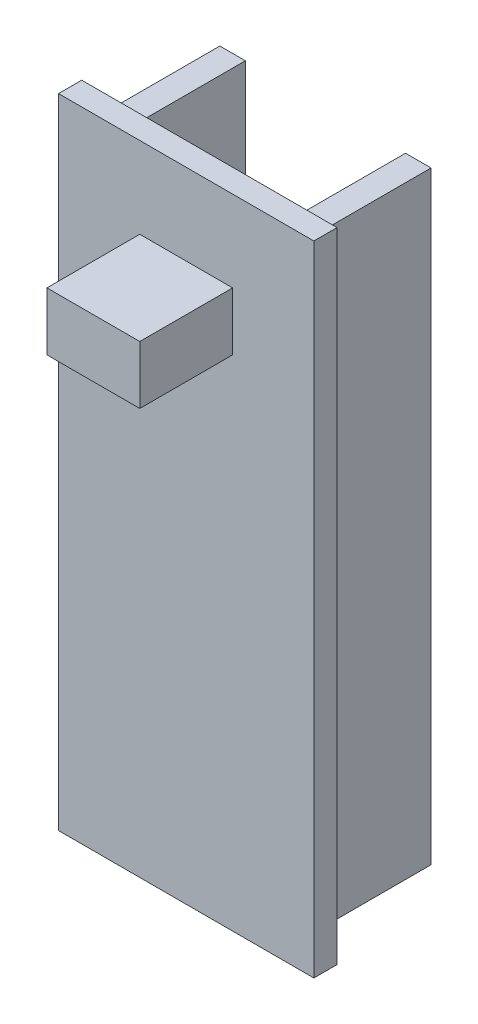
ISO-10303-21;
HEADER;
FILE_DESCRIPTION(('STEP AP214'),'2;1');
FILE_NAME('part.step','',(''),(''),'','','');
FILE_SCHEMA(('AUTOMOTIVE_DESIGN { 1 0 10303 214 1 1 1 1 }'));
ENDSEC;
DATA;
#1=APPLICATION_CONTEXT('core data for automotive mechanical design processes');
#2=APPLICATION_PROTOCOL_DEFINITION('international standard','automotive_design',2000,#1);
#3=PRODUCT_CONTEXT('',#1,'mechanical');
#4=PRODUCT('Part','Part','',(#3));
#5=PRODUCT_RELATED_PRODUCT_CATEGORY('part','',(#4));
#6=PRODUCT_DEFINITION_FORMATION('','',#4);
#7=PRODUCT_DEFINITION_CONTEXT('part definition',#1,'design');
#8=PRODUCT_DEFINITION('design','',#6,#7);
#9=PRODUCT_DEFINITION_SHAPE('','',#8);
#10=(LENGTH_UNIT() NAMED_UNIT(*) SI_UNIT(.MILLI.,.METRE.));
#11=(NAMED_UNIT(*) PLANE_ANGLE_UNIT() SI_UNIT($,.RADIAN.));
#12=(NAMED_UNIT(*) SI_UNIT($,.STERADIAN.) SOLID_ANGLE_UNIT());
#13=UNCERTAINTY_MEASURE_WITH_UNIT(LENGTH_MEASURE(1.E-05),#10,'distance_accuracy_value','');
#14=(GEOMETRIC_REPRESENTATION_CONTEXT(3) GLOBAL_UNCERTAINTY_ASSIGNED_CONTEXT((#13)) GLOBAL_UNIT_ASSIGNED_CONTEXT((#10,
#11,#12)) REPRESENTATION_CONTEXT('',''));
#15=CARTESIAN_POINT('',(0.,0.,0.));
#16=DIRECTION('',(0.,0.,1.));
#17=DIRECTION('',(1.,0.,0.));
#18=AXIS2_PLACEMENT_3D('',#15,#16,#17);
#19=CARTESIAN_POINT('',(0.,0.,2.));
#20=DIRECTION('',(0.,0.,-1.));
#21=DIRECTION('',(-1.,0.,0.));
#22=AXIS2_PLACEMENT_3D('',#19,#20,#21);
#23=PLANE('',#22);
#24=DIRECTION('',(0.,1.,0.));
#25=VECTOR('',#24,1.);
#26=CARTESIAN_POINT('',(11.,-27.5,2.));
#27=LINE('',#26,#25);
#28=CARTESIAN_POINT('',(11.,-27.5,2.));
#29=VERTEX_POINT('',#28);
#30=CARTESIAN_POINT('',(11.,27.5,2.));
#31=VERTEX_POINT('',#30);
#32=EDGE_CURVE('E272',#29,#31,#27,.T.);
#33=ORIENTED_EDGE('',*,*,#32,.T.);
#34=DIRECTION('',(-1.,0.,0.));
#35=VECTOR('',#34,1.);
#36=CARTESIAN_POINT('',(-11.,27.5,2.));
#37=LINE('',#36,#35);
#38=CARTESIAN_POINT('',(-11.,27.5,2.));
#39=VERTEX_POINT('',#38);
#40=EDGE_CURVE('E276',#31,#39,#37,.T.);
#41=ORIENTED_EDGE('',*,*,#40,.T.);
#42=DIRECTION('',(0.,-1.,0.));
#43=VECTOR('',#42,1.);
#44=CARTESIAN_POINT('',(-11.,-27.5,2.));
#45=LINE('',#44,#43);
#46=CARTESIAN_POINT('',(-11.,-27.5,2.));
#47=VERTEX_POINT('',#46);
#48=EDGE_CURVE('E280',#39,#47,#45,.T.);
#49=ORIENTED_EDGE('',*,*,#48,.T.);
#50=DIRECTION('',(1.,0.,0.));
#51=VECTOR('',#50,1.);
#52=CARTESIAN_POINT('',(-11.,-27.5,2.));
#53=LINE('',#52,#51);
#54=EDGE_CURVE('E283',#47,#29,#53,.T.);
#55=ORIENTED_EDGE('',*,*,#54,.T.);
#56=EDGE_LOOP('',(#33,#41,#49,#55));
#57=FACE_BOUND('',#56,.T.);
#58=DIRECTION('',(0.,1.,0.));
#59=VECTOR('',#58,1.);
#60=CARTESIAN_POINT('',(4.,15.5,2.));
#61=LINE('',#60,#59);
#62=CARTESIAN_POINT('',(4.,15.5,2.));
#63=VERTEX_POINT('',#62);
#64=CARTESIAN_POINT('',(4.,20.5,2.));
#65=VERTEX_POINT('',#64);
#66=EDGE_CURVE('E175',#63,#65,#61,.T.);
#67=ORIENTED_EDGE('',*,*,#66,.F.);
#68=DIRECTION('',(1.,0.,0.));
#69=VECTOR('',#68,1.);
#70=CARTESIAN_POINT('',(-4.,15.5,2.));
#71=LINE('',#70,#69);
#72=CARTESIAN_POINT('',(-4.,15.5,2.));
#73=VERTEX_POINT('',#72);
#74=EDGE_CURVE('E172',#73,#63,#71,.T.);
#75=ORIENTED_EDGE('',*,*,#74,.F.);
#76=DIRECTION('',(0.,-1.,0.));
#77=VECTOR('',#76,1.);
#78=CARTESIAN_POINT('',(-4.,15.5,2.));
#79=LINE('',#78,#77);
#80=CARTESIAN_POINT('',(-4.,20.5,2.));
#81=VERTEX_POINT('',#80);
#82=EDGE_CURVE('E60',#81,#73,#79,.T.);
#83=ORIENTED_EDGE('',*,*,#82,.F.);
#84=DIRECTION('',(-1.,0.,0.));
#85=VECTOR('',#84,1.);
#86=CARTESIAN_POINT('',(-4.,20.5,2.));
#87=LINE('',#86,#85);
#88=EDGE_CURVE('E55',#65,#81,#87,.T.);
#89=ORIENTED_EDGE('',*,*,#88,.F.);
#90=EDGE_LOOP('',(#67,#75,#83,#89));
#91=FACE_BOUND('',#90,.T.);
#92=ADVANCED_FACE('F39',(#57,#91),#23,.F.);
#93=CARTESIAN_POINT('',(11.,-27.5,2.));
#94=DIRECTION('',(-1.,0.,0.));
#95=DIRECTION('',(0.,0.,1.));
#96=AXIS2_PLACEMENT_3D('',#93,#94,#95);
#97=PLANE('',#96);
#98=DIRECTION('',(0.,1.,0.));
#99=VECTOR('',#98,1.);
#100=CARTESIAN_POINT('',(11.,-27.5,0.));
#101=LINE('',#100,#99);
#102=CARTESIAN_POINT('',(11.,-27.5,0.));
#103=VERTEX_POINT('',#102);
#104=CARTESIAN_POINT('',(11.,27.5,0.));
#105=VERTEX_POINT('',#104);
#106=EDGE_CURVE('E260',#103,#105,#101,.T.);
#107=ORIENTED_EDGE('',*,*,#106,.T.);
#108=DIRECTION('',(0.,0.,-1.));
#109=VECTOR('',#108,1.);
#110=CARTESIAN_POINT('',(11.,27.5,2.));
#111=LINE('',#110,#109);
#112=EDGE_CURVE('E11',#31,#105,#111,.T.);
#113=ORIENTED_EDGE('',*,*,#112,.F.);
#114=ORIENTED_EDGE('',*,*,#32,.F.);
#115=DIRECTION('',(0.,0.,-1.));
#116=VECTOR('',#115,1.);
#117=CARTESIAN_POINT('',(11.,-27.5,2.));
#118=LINE('',#117,#116);
#119=EDGE_CURVE('E286',#29,#103,#118,.T.);
#120=ORIENTED_EDGE('',*,*,#119,.T.);
#121=EDGE_LOOP('',(#107,#113,#114,#120));
#122=FACE_BOUND('',#121,.T.);
#123=ADVANCED_FACE('F41',(#122),#97,.F.);
#124=CARTESIAN_POINT('',(-11.,27.5,2.));
#125=DIRECTION('',(0.,-1.,0.));
#126=DIRECTION('',(0.,0.,-1.));
#127=AXIS2_PLACEMENT_3D('',#124,#125,#126);
#128=PLANE('',#127);
#129=DIRECTION('',(-1.,0.,0.));
#130=VECTOR('',#129,1.);
#131=CARTESIAN_POINT('',(-11.,27.5,0.));
#132=LINE('',#131,#130);
#133=CARTESIAN_POINT('',(-11.,27.5,0.));
#134=VERTEX_POINT('',#133);
#135=EDGE_CURVE('E290',#105,#134,#132,.T.);
#136=ORIENTED_EDGE('',*,*,#135,.T.);
#137=DIRECTION('',(0.,0.,-1.));
#138=VECTOR('',#137,1.);
#139=CARTESIAN_POINT('',(-11.,27.5,2.));
#140=LINE('',#139,#138);
#141=EDGE_CURVE('E48',#39,#134,#140,.T.);
#142=ORIENTED_EDGE('',*,*,#141,.F.);
#143=ORIENTED_EDGE('',*,*,#40,.F.);
#144=ORIENTED_EDGE('',*,*,#112,.T.);
#145=EDGE_LOOP('',(#136,#142,#143,#144));
#146=FACE_BOUND('',#145,.T.);
#147=ADVANCED_FACE('F325',(#146),#128,.F.);
#148=CARTESIAN_POINT('',(-11.,-27.5,2.));
#149=DIRECTION('',(1.,0.,0.));
#150=DIRECTION('',(0.,0.,-1.));
#151=AXIS2_PLACEMENT_3D('',#148,#149,#150);
#152=PLANE('',#151);
#153=DIRECTION('',(0.,-1.,0.));
#154=VECTOR('',#153,1.);
#155=CARTESIAN_POINT('',(-11.,-27.5,0.));
#156=LINE('',#155,#154);
#157=CARTESIAN_POINT('',(-11.,-27.5,0.));
#158=VERTEX_POINT('',#157);
#159=EDGE_CURVE('E293',#134,#158,#156,.T.);
#160=ORIENTED_EDGE('',*,*,#159,.T.);
#161=DIRECTION('',(0.,0.,-1.));
#162=VECTOR('',#161,1.);
#163=CARTESIAN_POINT('',(-11.,-27.5,2.));
#164=LINE('',#163,#162);
#165=EDGE_CURVE('E301',#47,#158,#164,.T.);
#166=ORIENTED_EDGE('',*,*,#165,.F.);
#167=ORIENTED_EDGE('',*,*,#48,.F.);
#168=ORIENTED_EDGE('',*,*,#141,.T.);
#169=EDGE_LOOP('',(#160,#166,#167,#168));
#170=FACE_BOUND('',#169,.T.);
#171=ADVANCED_FACE('F310',(#170),#152,.F.);
#172=CARTESIAN_POINT('',(-11.,-27.5,2.));
#173=DIRECTION('',(0.,1.,0.));
#174=DIRECTION('',(0.,0.,1.));
#175=AXIS2_PLACEMENT_3D('',#172,#173,#174);
#176=PLANE('',#175);
#177=DIRECTION('',(1.,0.,0.));
#178=VECTOR('',#177,1.);
#179=CARTESIAN_POINT('',(-11.,-27.5,0.));
#180=LINE('',#179,#178);
#181=EDGE_CURVE('E277',#158,#103,#180,.T.);
#182=ORIENTED_EDGE('',*,*,#181,.T.);
#183=ORIENTED_EDGE('',*,*,#119,.F.);
#184=ORIENTED_EDGE('',*,*,#54,.F.);
#185=ORIENTED_EDGE('',*,*,#165,.T.);
#186=EDGE_LOOP('',(#182,#183,#184,#185));
#187=FACE_BOUND('',#186,.T.);
#188=ADVANCED_FACE('F319',(#187),#176,.F.);
#189=CARTESIAN_POINT('',(0.,0.,0.));
#190=DIRECTION('',(0.,0.,-1.));
#191=DIRECTION('',(-1.,0.,0.));
#192=AXIS2_PLACEMENT_3D('',#189,#190,#191);
#193=PLANE('',#192);
#194=DIRECTION('',(0.,1.,0.));
#195=VECTOR('',#194,1.);
#196=CARTESIAN_POINT('',(9.10000000000018,-26.,0.));
#197=LINE('',#196,#195);
#198=CARTESIAN_POINT('',(9.10000000000018,-26.,0.));
#199=VERTEX_POINT('',#198);
#200=CARTESIAN_POINT('',(9.09999999999982,26.,0.));
#201=VERTEX_POINT('',#200);
#202=EDGE_CURVE('E177',#199,#201,#197,.T.);
#203=ORIENTED_EDGE('',*,*,#202,.T.);
#204=DIRECTION('',(-1.,0.,0.));
#205=VECTOR('',#204,1.);
#206=CARTESIAN_POINT('',(9.09999999999982,26.,0.));
#207=LINE('',#206,#205);
#208=CARTESIAN_POINT('',(6.89999999999982,26.,0.));
#209=VERTEX_POINT('',#208);
#210=EDGE_CURVE('E181',#201,#209,#207,.T.);
#211=ORIENTED_EDGE('',*,*,#210,.T.);
#212=DIRECTION('',(0.,-1.,0.));
#213=VECTOR('',#212,1.);
#214=CARTESIAN_POINT('',(6.90000000000018,-26.,0.));
#215=LINE('',#214,#213);
#216=CARTESIAN_POINT('',(6.90000000000018,-26.,0.));
#217=VERTEX_POINT('',#216);
#218=EDGE_CURVE('E207',#209,#217,#215,.T.);
#219=ORIENTED_EDGE('',*,*,#218,.T.);
#220=DIRECTION('',(1.,0.,0.));
#221=VECTOR('',#220,1.);
#222=CARTESIAN_POINT('',(9.10000000000018,-26.,0.));
#223=LINE('',#222,#221);
#224=EDGE_CURVE('E192',#217,#199,#223,.T.);
#225=ORIENTED_EDGE('',*,*,#224,.T.);
#226=EDGE_LOOP('',(#203,#211,#219,#225));
#227=FACE_BOUND('',#226,.T.);
#228=DIRECTION('',(0.,1.,0.));
#229=VECTOR('',#228,1.);
#230=CARTESIAN_POINT('',(-6.9,-26.,0.));
#231=LINE('',#230,#229);
#232=CARTESIAN_POINT('',(-6.9,-26.,0.));
#233=VERTEX_POINT('',#232);
#234=CARTESIAN_POINT('',(-6.9,26.,0.));
#235=VERTEX_POINT('',#234);
#236=EDGE_CURVE('E216',#233,#235,#231,.T.);
#237=ORIENTED_EDGE('',*,*,#236,.T.);
#238=DIRECTION('',(-1.,0.,0.));
#239=VECTOR('',#238,1.);
#240=CARTESIAN_POINT('',(-9.1,26.,0.));
#241=LINE('',#240,#239);
#242=CARTESIAN_POINT('',(-9.1,26.,0.));
#243=VERTEX_POINT('',#242);
#244=EDGE_CURVE('E248',#235,#243,#241,.T.);
#245=ORIENTED_EDGE('',*,*,#244,.T.);
#246=DIRECTION('',(0.,-1.,0.));
#247=VECTOR('',#246,1.);
#248=CARTESIAN_POINT('',(-9.1,-26.,0.));
#249=LINE('',#248,#247);
#250=CARTESIAN_POINT('',(-9.1,-26.,0.));
#251=VERTEX_POINT('',#250);
#252=EDGE_CURVE('E251',#243,#251,#249,.T.);
#253=ORIENTED_EDGE('',*,*,#252,.T.);
#254=DIRECTION('',(1.,0.,0.));
#255=VECTOR('',#254,1.);
#256=CARTESIAN_POINT('',(-9.1,-26.,0.));
#257=LINE('',#256,#255);
#258=EDGE_CURVE('E233',#251,#233,#257,.T.);
#259=ORIENTED_EDGE('',*,*,#258,.T.);
#260=EDGE_LOOP('',(#237,#245,#253,#259));
#261=FACE_BOUND('',#260,.T.);
#262=ORIENTED_EDGE('',*,*,#106,.F.);
#263=ORIENTED_EDGE('',*,*,#181,.F.);
#264=ORIENTED_EDGE('',*,*,#159,.F.);
#265=ORIENTED_EDGE('',*,*,#135,.F.);
#266=EDGE_LOOP('',(#262,#263,#264,#265));
#267=FACE_BOUND('',#266,.T.);
#268=ADVANCED_FACE('F316',(#227,#261,#267),#193,.T.);
#269=CARTESIAN_POINT('',(-6.9,-26.,-10.));
#270=DIRECTION('',(1.,0.,0.));
#271=DIRECTION('',(0.,1.,0.));
#272=AXIS2_PLACEMENT_3D('',#269,#270,#271);
#273=PLANE('',#272);
#274=ORIENTED_EDGE('',*,*,#236,.F.);
#275=DIRECTION('',(0.,0.,1.));
#276=VECTOR('',#275,1.);
#277=CARTESIAN_POINT('',(-6.9,-26.,-10.));
#278=LINE('',#277,#276);
#279=CARTESIAN_POINT('',(-6.9,-26.,-10.));
#280=VERTEX_POINT('',#279);
#281=EDGE_CURVE('E256',#280,#233,#278,.T.);
#282=ORIENTED_EDGE('',*,*,#281,.F.);
#283=DIRECTION('',(0.,1.,0.));
#284=VECTOR('',#283,1.);
#285=CARTESIAN_POINT('',(-6.9,-26.,-10.));
#286=LINE('',#285,#284);
#287=CARTESIAN_POINT('',(-6.9,26.,-10.));
#288=VERTEX_POINT('',#287);
#289=EDGE_CURVE('E228',#280,#288,#286,.T.);
#290=ORIENTED_EDGE('',*,*,#289,.T.);
#291=DIRECTION('',(0.,0.,1.));
#292=VECTOR('',#291,1.);
#293=CARTESIAN_POINT('',(-6.9,26.,-10.));
#294=LINE('',#293,#292);
#295=EDGE_CURVE('E245',#288,#235,#294,.T.);
#296=ORIENTED_EDGE('',*,*,#295,.T.);
#297=EDGE_LOOP('',(#274,#282,#290,#296));
#298=FACE_BOUND('',#297,.T.);
#299=ADVANCED_FACE('F338',(#298),#273,.T.);
#300=CARTESIAN_POINT('',(-9.1,-26.,-10.));
#301=DIRECTION('',(0.,-1.,0.));
#302=DIRECTION('',(0.,0.,-1.));
#303=AXIS2_PLACEMENT_3D('',#300,#301,#302);
#304=PLANE('',#303);
#305=ORIENTED_EDGE('',*,*,#258,.F.);
#306=DIRECTION('',(0.,0.,1.));
#307=VECTOR('',#306,1.);
#308=CARTESIAN_POINT('',(-9.1,-26.,-10.));
#309=LINE('',#308,#307);
#310=CARTESIAN_POINT('',(-9.1,-26.,-10.));
#311=VERTEX_POINT('',#310);
#312=EDGE_CURVE('E261',#311,#251,#309,.T.);
#313=ORIENTED_EDGE('',*,*,#312,.F.);
#314=DIRECTION('',(1.,0.,0.));
#315=VECTOR('',#314,1.);
#316=CARTESIAN_POINT('',(-9.1,-26.,-10.));
#317=LINE('',#316,#315);
#318=EDGE_CURVE('E241',#311,#280,#317,.T.);
#319=ORIENTED_EDGE('',*,*,#318,.T.);
#320=ORIENTED_EDGE('',*,*,#281,.T.);
#321=EDGE_LOOP('',(#305,#313,#319,#320));
#322=FACE_BOUND('',#321,.T.);
#323=ADVANCED_FACE('F358',(#322),#304,.T.);
#324=CARTESIAN_POINT('',(-9.1,-26.,-10.));
#325=DIRECTION('',(-1.,0.,0.));
#326=DIRECTION('',(0.,-1.,0.));
#327=AXIS2_PLACEMENT_3D('',#324,#325,#326);
#328=PLANE('',#327);
#329=ORIENTED_EDGE('',*,*,#252,.F.);
#330=DIRECTION('',(0.,0.,1.));
#331=VECTOR('',#330,1.);
#332=CARTESIAN_POINT('',(-9.1,26.,-10.));
#333=LINE('',#332,#331);
#334=CARTESIAN_POINT('',(-9.1,26.,-10.));
#335=VERTEX_POINT('',#334);
#336=EDGE_CURVE('E265',#335,#243,#333,.T.);
#337=ORIENTED_EDGE('',*,*,#336,.F.);
#338=DIRECTION('',(0.,-1.,0.));
#339=VECTOR('',#338,1.);
#340=CARTESIAN_POINT('',(-9.1,-26.,-10.));
#341=LINE('',#340,#339);
#342=EDGE_CURVE('E237',#335,#311,#341,.T.);
#343=ORIENTED_EDGE('',*,*,#342,.T.);
#344=ORIENTED_EDGE('',*,*,#312,.T.);
#345=EDGE_LOOP('',(#329,#337,#343,#344));
#346=FACE_BOUND('',#345,.T.);
#347=ADVANCED_FACE('F365',(#346),#328,.T.);
#348=CARTESIAN_POINT('',(-9.1,26.,-10.));
#349=DIRECTION('',(0.,1.,0.));
#350=DIRECTION('',(0.,0.,1.));
#351=AXIS2_PLACEMENT_3D('',#348,#349,#350);
#352=PLANE('',#351);
#353=ORIENTED_EDGE('',*,*,#244,.F.);
#354=ORIENTED_EDGE('',*,*,#295,.F.);
#355=DIRECTION('',(-1.,0.,0.));
#356=VECTOR('',#355,1.);
#357=CARTESIAN_POINT('',(-9.1,26.,-10.));
#358=LINE('',#357,#356);
#359=EDGE_CURVE('E232',#288,#335,#358,.T.);
#360=ORIENTED_EDGE('',*,*,#359,.T.);
#361=ORIENTED_EDGE('',*,*,#336,.T.);
#362=EDGE_LOOP('',(#353,#354,#360,#361));
#363=FACE_BOUND('',#362,.T.);
#364=ADVANCED_FACE('F373',(#363),#352,.T.);
#365=CARTESIAN_POINT('',(0.,0.,-10.));
#366=DIRECTION('',(0.,0.,-1.));
#367=DIRECTION('',(-1.,0.,0.));
#368=AXIS2_PLACEMENT_3D('',#365,#366,#367);
#369=PLANE('',#368);
#370=ORIENTED_EDGE('',*,*,#289,.F.);
#371=ORIENTED_EDGE('',*,*,#318,.F.);
#372=ORIENTED_EDGE('',*,*,#342,.F.);
#373=ORIENTED_EDGE('',*,*,#359,.F.);
#374=EDGE_LOOP('',(#370,#371,#372,#373));
#375=FACE_BOUND('',#374,.T.);
#376=ADVANCED_FACE('F381',(#375),#369,.T.);
#377=CARTESIAN_POINT('',(9.10000000000018,-26.,-10.));
#378=DIRECTION('',(1.,0.,0.));
#379=DIRECTION('',(0.,1.,0.));
#380=AXIS2_PLACEMENT_3D('',#377,#378,#379);
#381=PLANE('',#380);
#382=ORIENTED_EDGE('',*,*,#202,.F.);
#383=DIRECTION('',(0.,0.,1.));
#384=VECTOR('',#383,1.);
#385=CARTESIAN_POINT('',(9.10000000000018,-26.,-10.));
#386=LINE('',#385,#384);
#387=CARTESIAN_POINT('',(9.10000000000018,-26.,-10.));
#388=VERTEX_POINT('',#387);
#389=EDGE_CURVE('E212',#388,#199,#386,.T.);
#390=ORIENTED_EDGE('',*,*,#389,.F.);
#391=DIRECTION('',(0.,1.,0.));
#392=VECTOR('',#391,1.);
#393=CARTESIAN_POINT('',(9.10000000000018,-26.,-10.));
#394=LINE('',#393,#392);
#395=CARTESIAN_POINT('',(9.09999999999982,26.,-10.));
#396=VERTEX_POINT('',#395);
#397=EDGE_CURVE('E187',#388,#396,#394,.T.);
#398=ORIENTED_EDGE('',*,*,#397,.T.);
#399=DIRECTION('',(0.,0.,1.));
#400=VECTOR('',#399,1.);
#401=CARTESIAN_POINT('',(9.09999999999982,26.,-10.));
#402=LINE('',#401,#400);
#403=EDGE_CURVE('E203',#396,#201,#402,.T.);
#404=ORIENTED_EDGE('',*,*,#403,.T.);
#405=EDGE_LOOP('',(#382,#390,#398,#404));
#406=FACE_BOUND('',#405,.T.);
#407=ADVANCED_FACE('F388',(#406),#381,.T.);
#408=CARTESIAN_POINT('',(9.10000000000018,-26.,-10.));
#409=DIRECTION('',(0.,-1.,0.));
#410=DIRECTION('',(0.,0.,-1.));
#411=AXIS2_PLACEMENT_3D('',#408,#409,#410);
#412=PLANE('',#411);
#413=ORIENTED_EDGE('',*,*,#224,.F.);
#414=DIRECTION('',(0.,0.,1.));
#415=VECTOR('',#414,1.);
#416=CARTESIAN_POINT('',(6.90000000000018,-26.,-10.));
#417=LINE('',#416,#415);
#418=CARTESIAN_POINT('',(6.90000000000018,-26.,-10.));
#419=VERTEX_POINT('',#418);
#420=EDGE_CURVE('E217',#419,#217,#417,.T.);
#421=ORIENTED_EDGE('',*,*,#420,.F.);
#422=DIRECTION('',(1.,0.,0.));
#423=VECTOR('',#422,1.);
#424=CARTESIAN_POINT('',(9.10000000000018,-26.,-10.));
#425=LINE('',#424,#423);
#426=EDGE_CURVE('E200',#419,#388,#425,.T.);
#427=ORIENTED_EDGE('',*,*,#426,.T.);
#428=ORIENTED_EDGE('',*,*,#389,.T.);
#429=EDGE_LOOP('',(#413,#421,#427,#428));
#430=FACE_BOUND('',#429,.T.);
#431=ADVANCED_FACE('F396',(#430),#412,.T.);
#432=CARTESIAN_POINT('',(6.90000000000018,-26.,-10.));
#433=DIRECTION('',(-1.,0.,0.));
#434=DIRECTION('',(0.,-1.,0.));
#435=AXIS2_PLACEMENT_3D('',#432,#433,#434);
#436=PLANE('',#435);
#437=ORIENTED_EDGE('',*,*,#218,.F.);
#438=DIRECTION('',(0.,0.,1.));
#439=VECTOR('',#438,1.);
#440=CARTESIAN_POINT('',(6.89999999999982,26.,-10.));
#441=LINE('',#440,#439);
#442=CARTESIAN_POINT('',(6.89999999999982,26.,-10.));
#443=VERTEX_POINT('',#442);
#444=EDGE_CURVE('E221',#443,#209,#441,.T.);
#445=ORIENTED_EDGE('',*,*,#444,.F.);
#446=DIRECTION('',(0.,-1.,0.));
#447=VECTOR('',#446,1.);
#448=CARTESIAN_POINT('',(6.90000000000018,-26.,-10.));
#449=LINE('',#448,#447);
#450=EDGE_CURVE('E196',#443,#419,#449,.T.);
#451=ORIENTED_EDGE('',*,*,#450,.T.);
#452=ORIENTED_EDGE('',*,*,#420,.T.);
#453=EDGE_LOOP('',(#437,#445,#451,#452));
#454=FACE_BOUND('',#453,.T.);
#455=ADVANCED_FACE('F404',(#454),#436,.T.);
#456=CARTESIAN_POINT('',(9.09999999999982,26.,-10.));
#457=DIRECTION('',(0.,1.,0.));
#458=DIRECTION('',(0.,0.,1.));
#459=AXIS2_PLACEMENT_3D('',#456,#457,#458);
#460=PLANE('',#459);
#461=ORIENTED_EDGE('',*,*,#210,.F.);
#462=ORIENTED_EDGE('',*,*,#403,.F.);
#463=DIRECTION('',(-1.,0.,0.));
#464=VECTOR('',#463,1.);
#465=CARTESIAN_POINT('',(9.09999999999982,26.,-10.));
#466=LINE('',#465,#464);
#467=EDGE_CURVE('E191',#396,#443,#466,.T.);
#468=ORIENTED_EDGE('',*,*,#467,.T.);
#469=ORIENTED_EDGE('',*,*,#444,.T.);
#470=EDGE_LOOP('',(#461,#462,#468,#469));
#471=FACE_BOUND('',#470,.T.);
#472=ADVANCED_FACE('F412',(#471),#460,.T.);
#473=CARTESIAN_POINT('',(0.,0.,-10.));
#474=DIRECTION('',(0.,0.,1.));
#475=DIRECTION('',(1.,0.,0.));
#476=AXIS2_PLACEMENT_3D('',#473,#474,#475);
#477=PLANE('',#476);
#478=ORIENTED_EDGE('',*,*,#397,.F.);
#479=ORIENTED_EDGE('',*,*,#426,.F.);
#480=ORIENTED_EDGE('',*,*,#450,.F.);
#481=ORIENTED_EDGE('',*,*,#467,.F.);
#482=EDGE_LOOP('',(#478,#479,#480,#481));
#483=FACE_BOUND('',#482,.T.);
#484=ADVANCED_FACE('F420',(#483),#477,.F.);
#485=CARTESIAN_POINT('',(4.,15.5,10.));
#486=DIRECTION('',(-1.,0.,0.));
#487=DIRECTION('',(0.,0.,1.));
#488=AXIS2_PLACEMENT_3D('',#485,#486,#487);
#489=PLANE('',#488);
#490=ORIENTED_EDGE('',*,*,#66,.T.);
#491=DIRECTION('',(0.,0.,-1.));
#492=VECTOR('',#491,1.);
#493=CARTESIAN_POINT('',(4.,20.5,10.));
#494=LINE('',#493,#492);
#495=CARTESIAN_POINT('',(4.,20.5,10.));
#496=VERTEX_POINT('',#495);
#497=EDGE_CURVE('E154',#496,#65,#494,.T.);
#498=ORIENTED_EDGE('',*,*,#497,.F.);
#499=DIRECTION('',(0.,1.,0.));
#500=VECTOR('',#499,1.);
#501=CARTESIAN_POINT('',(4.,15.5,10.));
#502=LINE('',#501,#500);
#503=CARTESIAN_POINT('',(4.,15.5,10.));
#504=VERTEX_POINT('',#503);
#505=EDGE_CURVE('E162',#504,#496,#502,.T.);
#506=ORIENTED_EDGE('',*,*,#505,.F.);
#507=DIRECTION('',(0.,0.,-1.));
#508=VECTOR('',#507,1.);
#509=CARTESIAN_POINT('',(4.,15.5,10.));
#510=LINE('',#509,#508);
#511=EDGE_CURVE('E519',#504,#63,#510,.T.);
#512=ORIENTED_EDGE('',*,*,#511,.T.);
#513=EDGE_LOOP('',(#490,#498,#506,#512));
#514=FACE_BOUND('',#513,.T.);
#515=ADVANCED_FACE('F174',(#514),#489,.F.);
#516=CARTESIAN_POINT('',(-4.,20.5,10.));
#517=DIRECTION('',(0.,-1.,0.));
#518=DIRECTION('',(0.,0.,-1.));
#519=AXIS2_PLACEMENT_3D('',#516,#517,#518);
#520=PLANE('',#519);
#521=ORIENTED_EDGE('',*,*,#88,.T.);
#522=DIRECTION('',(0.,0.,-1.));
#523=VECTOR('',#522,1.);
#524=CARTESIAN_POINT('',(-4.,20.5,10.));
#525=LINE('',#524,#523);
#526=CARTESIAN_POINT('',(-4.,20.5,10.));
#527=VERTEX_POINT('',#526);
#528=EDGE_CURVE('E157',#527,#81,#525,.T.);
#529=ORIENTED_EDGE('',*,*,#528,.F.);
#530=DIRECTION('',(-1.,0.,0.));
#531=VECTOR('',#530,1.);
#532=CARTESIAN_POINT('',(-4.,20.5,10.));
#533=LINE('',#532,#531);
#534=EDGE_CURVE('E150',#496,#527,#533,.T.);
#535=ORIENTED_EDGE('',*,*,#534,.F.);
#536=ORIENTED_EDGE('',*,*,#497,.T.);
#537=EDGE_LOOP('',(#521,#529,#535,#536));
#538=FACE_BOUND('',#537,.T.);
#539=ADVANCED_FACE('F152',(#538),#520,.F.);
#540=CARTESIAN_POINT('',(-4.,15.5,10.));
#541=DIRECTION('',(1.,0.,0.));
#542=DIRECTION('',(0.,0.,-1.));
#543=AXIS2_PLACEMENT_3D('',#540,#541,#542);
#544=PLANE('',#543);
#545=ORIENTED_EDGE('',*,*,#82,.T.);
#546=DIRECTION('',(0.,0.,-1.));
#547=VECTOR('',#546,1.);
#548=CARTESIAN_POINT('',(-4.,15.5,10.));
#549=LINE('',#548,#547);
#550=CARTESIAN_POINT('',(-4.,15.5,10.));
#551=VERTEX_POINT('',#550);
#552=EDGE_CURVE('E183',#551,#73,#549,.T.);
#553=ORIENTED_EDGE('',*,*,#552,.F.);
#554=DIRECTION('',(0.,-1.,0.));
#555=VECTOR('',#554,1.);
#556=CARTESIAN_POINT('',(-4.,15.5,10.));
#557=LINE('',#556,#555);
#558=EDGE_CURVE('E161',#527,#551,#557,.T.);
#559=ORIENTED_EDGE('',*,*,#558,.F.);
#560=ORIENTED_EDGE('',*,*,#528,.T.);
#561=EDGE_LOOP('',(#545,#553,#559,#560));
#562=FACE_BOUND('',#561,.T.);
#563=ADVANCED_FACE('F441',(#562),#544,.F.);
#564=CARTESIAN_POINT('',(-4.,15.5,10.));
#565=DIRECTION('',(0.,1.,0.));
#566=DIRECTION('',(0.,0.,1.));
#567=AXIS2_PLACEMENT_3D('',#564,#565,#566);
#568=PLANE('',#567);
#569=ORIENTED_EDGE('',*,*,#74,.T.);
#570=ORIENTED_EDGE('',*,*,#511,.F.);
#571=DIRECTION('',(1.,0.,0.));
#572=VECTOR('',#571,1.);
#573=CARTESIAN_POINT('',(-4.,15.5,10.));
#574=LINE('',#573,#572);
#575=EDGE_CURVE('E167',#551,#504,#574,.T.);
#576=ORIENTED_EDGE('',*,*,#575,.F.);
#577=ORIENTED_EDGE('',*,*,#552,.T.);
#578=EDGE_LOOP('',(#569,#570,#576,#577));
#579=FACE_BOUND('',#578,.T.);
#580=ADVANCED_FACE('F448',(#579),#568,.F.);
#581=CARTESIAN_POINT('',(0.,0.,10.));
#582=DIRECTION('',(0.,0.,-1.));
#583=DIRECTION('',(-1.,0.,0.));
#584=AXIS2_PLACEMENT_3D('',#581,#582,#583);
#585=PLANE('',#584);
#586=ORIENTED_EDGE('',*,*,#505,.T.);
#587=ORIENTED_EDGE('',*,*,#534,.T.);
#588=ORIENTED_EDGE('',*,*,#558,.T.);
#589=ORIENTED_EDGE('',*,*,#575,.T.);
#590=EDGE_LOOP('',(#586,#587,#588,#589));
#591=FACE_BOUND('',#590,.T.);
#592=ADVANCED_FACE('F165',(#591),#585,.F.);
#593=CLOSED_SHELL('',(#92,#123,#147,#171,#188,#268,#299,#323,#347,#364,#376,#407,#431,#455,#472,
#484,#515,#539,#563,#580,#592));
#594=MANIFOLD_SOLID_BREP('B2',#593);
#595=ADVANCED_BREP_SHAPE_REPRESENTATION('',(#18,#594),#14);
#596=SHAPE_DEFINITION_REPRESENTATION(#9,#595);
ENDSEC;
END-ISO-10303-21;
